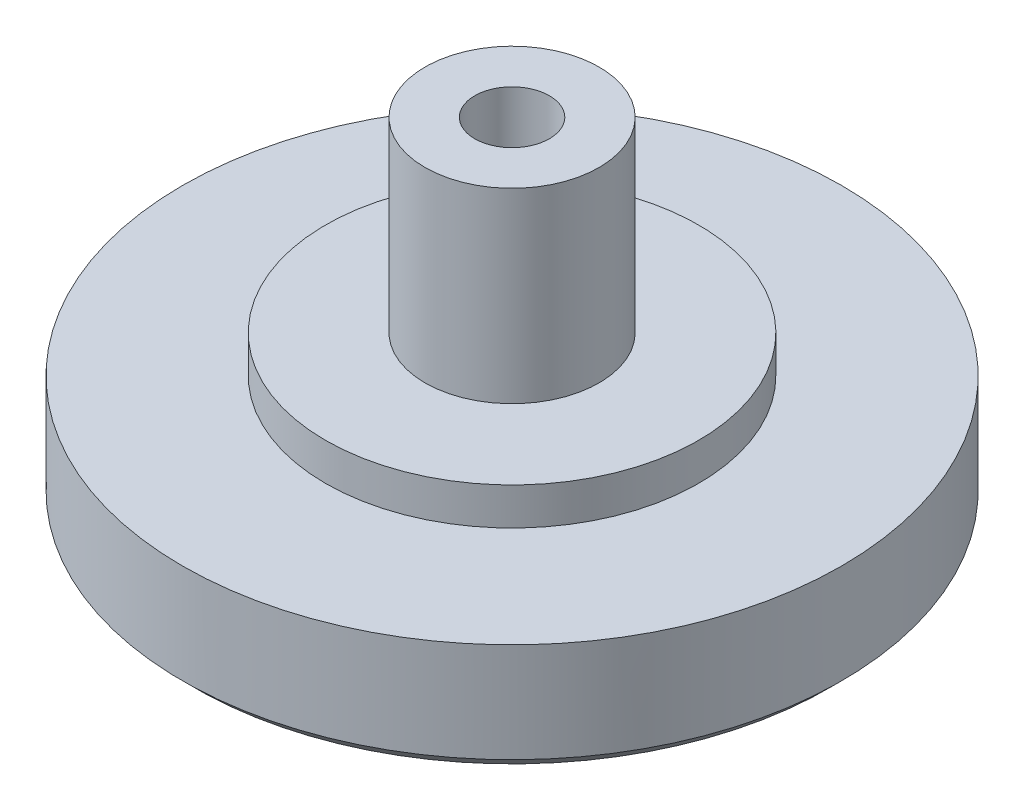
ISO-10303-21;
HEADER;
FILE_DESCRIPTION(('STEP AP214'),'2;1');
FILE_NAME('part.step','',(''),(''),'','','');
FILE_SCHEMA(('AUTOMOTIVE_DESIGN { 1 0 10303 214 1 1 1 1 }'));
ENDSEC;
DATA;
#1=APPLICATION_CONTEXT('core data for automotive mechanical design processes');
#2=APPLICATION_PROTOCOL_DEFINITION('international standard','automotive_design',2000,#1);
#3=PRODUCT_CONTEXT('',#1,'mechanical');
#4=PRODUCT('Part','Part','',(#3));
#5=PRODUCT_RELATED_PRODUCT_CATEGORY('part','',(#4));
#6=PRODUCT_DEFINITION_FORMATION('','',#4);
#7=PRODUCT_DEFINITION_CONTEXT('part definition',#1,'design');
#8=PRODUCT_DEFINITION('design','',#6,#7);
#9=PRODUCT_DEFINITION_SHAPE('','',#8);
#10=(LENGTH_UNIT() NAMED_UNIT(*) SI_UNIT(.MILLI.,.METRE.));
#11=(NAMED_UNIT(*) PLANE_ANGLE_UNIT() SI_UNIT($,.RADIAN.));
#12=(NAMED_UNIT(*) SI_UNIT($,.STERADIAN.) SOLID_ANGLE_UNIT());
#13=UNCERTAINTY_MEASURE_WITH_UNIT(LENGTH_MEASURE(1.E-05),#10,'distance_accuracy_value','');
#14=(GEOMETRIC_REPRESENTATION_CONTEXT(3) GLOBAL_UNCERTAINTY_ASSIGNED_CONTEXT((#13)) GLOBAL_UNIT_ASSIGNED_CONTEXT((#10,
#11,#12)) REPRESENTATION_CONTEXT('',''));
#15=CARTESIAN_POINT('',(0.,0.,0.));
#16=DIRECTION('',(0.,0.,1.));
#17=DIRECTION('',(1.,0.,0.));
#18=AXIS2_PLACEMENT_3D('',#15,#16,#17);
#19=CARTESIAN_POINT('',(0.,8.,0.));
#20=DIRECTION('',(0.,-1.,0.));
#21=DIRECTION('',(0.,0.,-1.));
#22=AXIS2_PLACEMENT_3D('',#19,#20,#21);
#23=CYLINDRICAL_SURFACE('',#22,26.5);
#24=CARTESIAN_POINT('',(0.,8.,0.));
#25=DIRECTION('',(0.,1.,0.));
#26=DIRECTION('',(0.,0.,1.));
#27=AXIS2_PLACEMENT_3D('',#24,#25,#26);
#28=CIRCLE('',#27,26.5);
#29=CARTESIAN_POINT('',(0.,8.,26.5));
#30=VERTEX_POINT('',#29);
#31=EDGE_CURVE('E44',#30,#30,#28,.T.);
#32=ORIENTED_EDGE('',*,*,#31,.F.);
#33=EDGE_LOOP('',(#32));
#34=FACE_BOUND('',#33,.T.);
#35=CARTESIAN_POINT('',(0.,0.,0.));
#36=DIRECTION('',(0.,-1.,0.));
#37=DIRECTION('',(0.,0.,-1.));
#38=AXIS2_PLACEMENT_3D('',#35,#36,#37);
#39=CIRCLE('',#38,26.5);
#40=CARTESIAN_POINT('',(0.,0.,-26.5));
#41=VERTEX_POINT('',#40);
#42=EDGE_CURVE('E69',#41,#41,#39,.T.);
#43=ORIENTED_EDGE('',*,*,#42,.F.);
#44=EDGE_LOOP('',(#43));
#45=FACE_BOUND('',#44,.T.);
#46=ADVANCED_FACE('F41',(#34,#45),#23,.T.);
#47=CARTESIAN_POINT('',(0.,8.,0.));
#48=DIRECTION('',(0.,1.,0.));
#49=DIRECTION('',(0.,0.,1.));
#50=AXIS2_PLACEMENT_3D('',#47,#48,#49);
#51=PLANE('',#50);
#52=CARTESIAN_POINT('',(0.,8.,0.));
#53=DIRECTION('',(0.,1.,0.));
#54=DIRECTION('',(0.,0.,1.));
#55=AXIS2_PLACEMENT_3D('',#52,#53,#54);
#56=CIRCLE('',#55,15.);
#57=CARTESIAN_POINT('',(0.,8.,15.));
#58=VERTEX_POINT('',#57);
#59=EDGE_CURVE('E49',#58,#58,#56,.T.);
#60=ORIENTED_EDGE('',*,*,#59,.F.);
#61=EDGE_LOOP('',(#60));
#62=FACE_BOUND('',#61,.T.);
#63=ORIENTED_EDGE('',*,*,#31,.T.);
#64=EDGE_LOOP('',(#63));
#65=FACE_BOUND('',#64,.T.);
#66=ADVANCED_FACE('F84',(#62,#65),#51,.T.);
#67=CARTESIAN_POINT('',(0.,0.,0.));
#68=DIRECTION('',(0.,1.,0.));
#69=DIRECTION('',(0.,0.,-1.));
#70=AXIS2_PLACEMENT_3D('',#67,#68,#69);
#71=CONICAL_SURFACE('',#70,26.5,0.78539816339745);
#72=CARTESIAN_POINT('',(0.,-1.,0.));
#73=DIRECTION('',(0.,-1.,0.));
#74=DIRECTION('',(0.,0.,-1.));
#75=AXIS2_PLACEMENT_3D('',#72,#73,#74);
#76=CIRCLE('',#75,25.5);
#77=CARTESIAN_POINT('',(0.,-1.,-25.5));
#78=VERTEX_POINT('',#77);
#79=EDGE_CURVE('E75',#78,#78,#76,.T.);
#80=ORIENTED_EDGE('',*,*,#79,.F.);
#81=EDGE_LOOP('',(#80));
#82=FACE_BOUND('',#81,.T.);
#83=ORIENTED_EDGE('',*,*,#42,.T.);
#84=EDGE_LOOP('',(#83));
#85=FACE_BOUND('',#84,.T.);
#86=ADVANCED_FACE('F90',(#82,#85),#71,.T.);
#87=CARTESIAN_POINT('',(0.,-1.,0.));
#88=DIRECTION('',(0.,-1.,0.));
#89=DIRECTION('',(0.,0.,-1.));
#90=AXIS2_PLACEMENT_3D('',#87,#88,#89);
#91=PLANE('',#90);
#92=CARTESIAN_POINT('',(0.,-1.,0.));
#93=DIRECTION('',(0.,-1.,0.));
#94=DIRECTION('',(0.,0.,-1.));
#95=AXIS2_PLACEMENT_3D('',#92,#93,#94);
#96=CIRCLE('',#95,17.5);
#97=CARTESIAN_POINT('',(0.,-1.,-17.5));
#98=VERTEX_POINT('',#97);
#99=EDGE_CURVE('E55',#98,#98,#96,.T.);
#100=ORIENTED_EDGE('',*,*,#99,.F.);
#101=EDGE_LOOP('',(#100));
#102=FACE_BOUND('',#101,.T.);
#103=ORIENTED_EDGE('',*,*,#79,.T.);
#104=EDGE_LOOP('',(#103));
#105=FACE_BOUND('',#104,.T.);
#106=ADVANCED_FACE('F92',(#102,#105),#91,.T.);
#107=CARTESIAN_POINT('',(0.,-2.,0.));
#108=DIRECTION('',(0.,1.,0.));
#109=DIRECTION('',(0.,0.,1.));
#110=AXIS2_PLACEMENT_3D('',#107,#108,#109);
#111=CYLINDRICAL_SURFACE('',#110,17.5);
#112=CARTESIAN_POINT('',(0.,-2.,0.));
#113=DIRECTION('',(0.,-1.,0.));
#114=DIRECTION('',(0.,0.,-1.));
#115=AXIS2_PLACEMENT_3D('',#112,#113,#114);
#116=CIRCLE('',#115,17.5);
#117=CARTESIAN_POINT('',(0.,-2.,-17.5));
#118=VERTEX_POINT('',#117);
#119=EDGE_CURVE('E64',#118,#118,#116,.T.);
#120=ORIENTED_EDGE('',*,*,#119,.F.);
#121=EDGE_LOOP('',(#120));
#122=FACE_BOUND('',#121,.T.);
#123=ORIENTED_EDGE('',*,*,#99,.T.);
#124=EDGE_LOOP('',(#123));
#125=FACE_BOUND('',#124,.T.);
#126=ADVANCED_FACE('F99',(#122,#125),#111,.T.);
#127=CARTESIAN_POINT('',(0.,-2.,0.));
#128=DIRECTION('',(0.,-1.,0.));
#129=DIRECTION('',(0.,0.,-1.));
#130=AXIS2_PLACEMENT_3D('',#127,#128,#129);
#131=PLANE('',#130);
#132=ORIENTED_EDGE('',*,*,#119,.T.);
#133=EDGE_LOOP('',(#132));
#134=FACE_BOUND('',#133,.T.);
#135=ADVANCED_FACE('F106',(#134),#131,.T.);
#136=CARTESIAN_POINT('',(0.,11.,0.));
#137=DIRECTION('',(0.,-1.,0.));
#138=DIRECTION('',(0.,0.,-1.));
#139=AXIS2_PLACEMENT_3D('',#136,#137,#138);
#140=CYLINDRICAL_SURFACE('',#139,15.);
#141=CARTESIAN_POINT('',(0.,11.,0.));
#142=DIRECTION('',(0.,1.,0.));
#143=DIRECTION('',(0.,0.,1.));
#144=AXIS2_PLACEMENT_3D('',#141,#142,#143);
#145=CIRCLE('',#144,15.);
#146=CARTESIAN_POINT('',(0.,11.,15.));
#147=VERTEX_POINT('',#146);
#148=EDGE_CURVE('E61',#147,#147,#145,.T.);
#149=ORIENTED_EDGE('',*,*,#148,.F.);
#150=EDGE_LOOP('',(#149));
#151=FACE_BOUND('',#150,.T.);
#152=ORIENTED_EDGE('',*,*,#59,.T.);
#153=EDGE_LOOP('',(#152));
#154=FACE_BOUND('',#153,.T.);
#155=ADVANCED_FACE('F110',(#151,#154),#140,.T.);
#156=CARTESIAN_POINT('',(0.,11.,0.));
#157=DIRECTION('',(0.,1.,0.));
#158=DIRECTION('',(0.,0.,1.));
#159=AXIS2_PLACEMENT_3D('',#156,#157,#158);
#160=PLANE('',#159);
#161=CARTESIAN_POINT('',(0.,11.,0.));
#162=DIRECTION('',(0.,1.,0.));
#163=DIRECTION('',(0.,0.,1.));
#164=AXIS2_PLACEMENT_3D('',#161,#162,#163);
#165=CIRCLE('',#164,7.);
#166=CARTESIAN_POINT('',(0.,11.,7.));
#167=VERTEX_POINT('',#166);
#168=EDGE_CURVE('E10',#167,#167,#165,.T.);
#169=ORIENTED_EDGE('',*,*,#168,.F.);
#170=EDGE_LOOP('',(#169));
#171=FACE_BOUND('',#170,.T.);
#172=ORIENTED_EDGE('',*,*,#148,.T.);
#173=EDGE_LOOP('',(#172));
#174=FACE_BOUND('',#173,.T.);
#175=ADVANCED_FACE('F114',(#171,#174),#160,.T.);
#176=CARTESIAN_POINT('',(0.,26.,0.));
#177=DIRECTION('',(0.,-1.,0.));
#178=DIRECTION('',(0.,0.,-1.));
#179=AXIS2_PLACEMENT_3D('',#176,#177,#178);
#180=CYLINDRICAL_SURFACE('',#179,7.);
#181=CARTESIAN_POINT('',(0.,26.,0.));
#182=DIRECTION('',(0.,1.,0.));
#183=DIRECTION('',(0.,0.,1.));
#184=AXIS2_PLACEMENT_3D('',#181,#182,#183);
#185=CIRCLE('',#184,7.);
#186=CARTESIAN_POINT('',(0.,26.,7.));
#187=VERTEX_POINT('',#186);
#188=EDGE_CURVE('E59',#187,#187,#185,.T.);
#189=ORIENTED_EDGE('',*,*,#188,.F.);
#190=EDGE_LOOP('',(#189));
#191=FACE_BOUND('',#190,.T.);
#192=ORIENTED_EDGE('',*,*,#168,.T.);
#193=EDGE_LOOP('',(#192));
#194=FACE_BOUND('',#193,.T.);
#195=ADVANCED_FACE('F118',(#191,#194),#180,.T.);
#196=CARTESIAN_POINT('',(0.,26.,0.));
#197=DIRECTION('',(0.,1.,0.));
#198=DIRECTION('',(0.,0.,1.));
#199=AXIS2_PLACEMENT_3D('',#196,#197,#198);
#200=PLANE('',#199);
#201=CARTESIAN_POINT('',(0.,26.,0.));
#202=DIRECTION('',(0.,1.,0.));
#203=DIRECTION('',(0.,0.,1.));
#204=AXIS2_PLACEMENT_3D('',#201,#202,#203);
#205=CIRCLE('',#204,3.);
#206=CARTESIAN_POINT('',(0.,26.,3.));
#207=VERTEX_POINT('',#206);
#208=EDGE_CURVE('E140',#207,#207,#205,.T.);
#209=ORIENTED_EDGE('',*,*,#208,.F.);
#210=EDGE_LOOP('',(#209));
#211=FACE_BOUND('',#210,.T.);
#212=ORIENTED_EDGE('',*,*,#188,.T.);
#213=EDGE_LOOP('',(#212));
#214=FACE_BOUND('',#213,.T.);
#215=ADVANCED_FACE('F122',(#211,#214),#200,.T.);
#216=CARTESIAN_POINT('',(0.,17.,0.));
#217=DIRECTION('',(0.,1.,0.));
#218=DIRECTION('',(0.,0.,1.));
#219=AXIS2_PLACEMENT_3D('',#216,#217,#218);
#220=CYLINDRICAL_SURFACE('',#219,3.);
#221=CARTESIAN_POINT('',(0.,17.,0.));
#222=DIRECTION('',(0.,1.,0.));
#223=DIRECTION('',(0.,0.,1.));
#224=AXIS2_PLACEMENT_3D('',#221,#222,#223);
#225=CIRCLE('',#224,3.);
#226=CARTESIAN_POINT('',(0.,17.,3.));
#227=VERTEX_POINT('',#226);
#228=EDGE_CURVE('E138',#227,#227,#225,.T.);
#229=ORIENTED_EDGE('',*,*,#228,.F.);
#230=EDGE_LOOP('',(#229));
#231=FACE_BOUND('',#230,.T.);
#232=ORIENTED_EDGE('',*,*,#208,.T.);
#233=EDGE_LOOP('',(#232));
#234=FACE_BOUND('',#233,.T.);
#235=ADVANCED_FACE('F126',(#231,#234),#220,.F.);
#236=CARTESIAN_POINT('',(0.,17.,0.));
#237=DIRECTION('',(0.,1.,0.));
#238=DIRECTION('',(0.,0.,1.));
#239=AXIS2_PLACEMENT_3D('',#236,#237,#238);
#240=PLANE('',#239);
#241=ORIENTED_EDGE('',*,*,#228,.T.);
#242=EDGE_LOOP('',(#241));
#243=FACE_BOUND('',#242,.T.);
#244=ADVANCED_FACE('F130',(#243),#240,.T.);
#245=CLOSED_SHELL('',(#46,#66,#86,#106,#126,#135,#155,#175,#195,#215,#235,#244));
#246=MANIFOLD_SOLID_BREP('B2',#245);
#247=ADVANCED_BREP_SHAPE_REPRESENTATION('',(#18,#246),#14);
#248=SHAPE_DEFINITION_REPRESENTATION(#9,#247);
ENDSEC;
END-ISO-10303-21;
